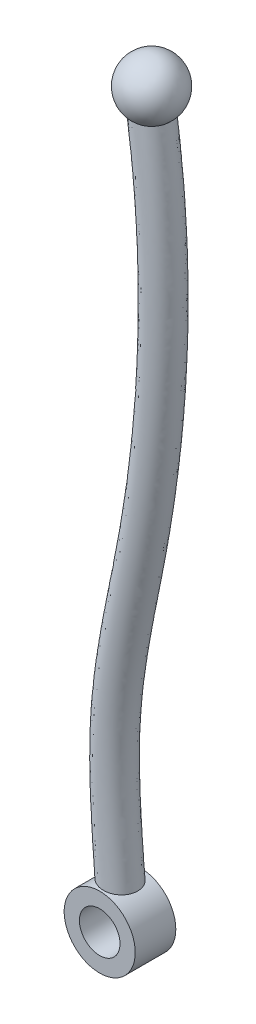
ISO-10303-21;
HEADER;
FILE_DESCRIPTION(('STEP AP214'),'2;1');
FILE_NAME('part.step','',(''),(''),'','','');
FILE_SCHEMA(('AUTOMOTIVE_DESIGN { 1 0 10303 214 1 1 1 1 }'));
ENDSEC;
DATA;
#1=APPLICATION_CONTEXT('core data for automotive mechanical design processes');
#2=APPLICATION_PROTOCOL_DEFINITION('international standard','automotive_design',2000,#1);
#3=PRODUCT_CONTEXT('',#1,'mechanical');
#4=PRODUCT('Part','Part','',(#3));
#5=PRODUCT_RELATED_PRODUCT_CATEGORY('part','',(#4));
#6=PRODUCT_DEFINITION_FORMATION('','',#4);
#7=PRODUCT_DEFINITION_CONTEXT('part definition',#1,'design');
#8=PRODUCT_DEFINITION('design','',#6,#7);
#9=PRODUCT_DEFINITION_SHAPE('','',#8);
#10=(LENGTH_UNIT() NAMED_UNIT(*) SI_UNIT(.MILLI.,.METRE.));
#11=(NAMED_UNIT(*) PLANE_ANGLE_UNIT() SI_UNIT($,.RADIAN.));
#12=(NAMED_UNIT(*) SI_UNIT($,.STERADIAN.) SOLID_ANGLE_UNIT());
#13=UNCERTAINTY_MEASURE_WITH_UNIT(LENGTH_MEASURE(1.E-05),#10,'distance_accuracy_value','');
#14=(GEOMETRIC_REPRESENTATION_CONTEXT(3) GLOBAL_UNCERTAINTY_ASSIGNED_CONTEXT((#13)) GLOBAL_UNIT_ASSIGNED_CONTEXT((#10,
#11,#12)) REPRESENTATION_CONTEXT('',''));
#15=CARTESIAN_POINT('',(0.,0.,0.));
#16=DIRECTION('',(0.,0.,1.));
#17=DIRECTION('',(1.,0.,0.));
#18=AXIS2_PLACEMENT_3D('',#15,#16,#17);
#19=CARTESIAN_POINT('',(0.,-7.,3.96039759223717));
#20=DIRECTION('',(0.,-1.,0.));
#21=DIRECTION('',(0.,0.,-1.));
#22=AXIS2_PLACEMENT_3D('',#19,#20,#21);
#23=PLANE('',#22);
#24=CARTESIAN_POINT('',(0.,-7.,4.));
#25=DIRECTION('',(0.,1.,0.));
#26=DIRECTION('',(0.,0.,1.));
#27=AXIS2_PLACEMENT_3D('',#24,#25,#26);
#28=CIRCLE('',#27,0.0396024077628267);
#29=CARTESIAN_POINT('',(0.,-7.,4.03960240776283));
#30=VERTEX_POINT('',#29);
#31=EDGE_CURVE('E66',#30,#30,#28,.T.);
#32=ORIENTED_EDGE('',*,*,#31,.T.);
#33=EDGE_LOOP('',(#32));
#34=FACE_BOUND('',#33,.T.);
#35=ADVANCED_FACE('F60',(#34),#23,.F.);
#36=CARTESIAN_POINT('',(0.,-7.03089007137969,4.));
#37=DIRECTION('',(0.,1.,0.));
#38=DIRECTION('',(0.,0.,1.));
#39=AXIS2_PLACEMENT_3D('',#36,#37,#38);
#40=PLANE('',#39);
#41=CARTESIAN_POINT('',(0.,-7.03089007137969,4.));
#42=DIRECTION('',(0.,1.,0.));
#43=DIRECTION('',(0.,0.,1.));
#44=AXIS2_PLACEMENT_3D('',#41,#42,#43);
#45=CIRCLE('',#44,0.0396024077628267);
#46=CARTESIAN_POINT('',(0.,-7.03089007137969,4.03960240776283));
#47=VERTEX_POINT('',#46);
#48=EDGE_CURVE('E12',#47,#47,#45,.T.);
#49=ORIENTED_EDGE('',*,*,#48,.F.);
#50=EDGE_LOOP('',(#49));
#51=FACE_BOUND('',#50,.T.);
#52=ADVANCED_FACE('F75',(#51),#40,.F.);
#53=CARTESIAN_POINT('',(0.,-7.,4.));
#54=DIRECTION('',(0.,1.,0.));
#55=DIRECTION('',(0.,0.,1.));
#56=AXIS2_PLACEMENT_3D('',#53,#54,#55);
#57=CYLINDRICAL_SURFACE('',#56,0.0396024077628267);
#58=ORIENTED_EDGE('',*,*,#31,.F.);
#59=EDGE_LOOP('',(#58));
#60=FACE_BOUND('',#59,.T.);
#61=ORIENTED_EDGE('',*,*,#48,.T.);
#62=EDGE_LOOP('',(#61));
#63=FACE_BOUND('',#62,.T.);
#64=ADVANCED_FACE('F73',(#60,#63),#57,.T.);
#65=CLOSED_SHELL('',(#35,#52,#64));
#66=MANIFOLD_SOLID_BREP('B2',#65);
#67=CARTESIAN_POINT('',(0.,0.,8.));
#68=DIRECTION('',(0.,0.,-1.));
#69=DIRECTION('',(-1.,0.,0.));
#70=AXIS2_PLACEMENT_3D('',#67,#68,#69);
#71=CYLINDRICAL_SURFACE('',#70,7.);
#72=CARTESIAN_POINT('',(0.,0.,0.));
#73=DIRECTION('',(0.,0.,1.));
#74=DIRECTION('',(1.,0.,0.));
#75=AXIS2_PLACEMENT_3D('',#72,#73,#74);
#76=CIRCLE('',#75,7.);
#77=CARTESIAN_POINT('',(7.,0.,0.));
#78=VERTEX_POINT('',#77);
#79=EDGE_CURVE('E146',#78,#78,#76,.T.);
#80=ORIENTED_EDGE('',*,*,#79,.T.);
#81=EDGE_LOOP('',(#80));
#82=FACE_BOUND('',#81,.T.);
#83=CARTESIAN_POINT('',(0.,0.,8.));
#84=DIRECTION('',(0.,0.,1.));
#85=DIRECTION('',(1.,0.,0.));
#86=AXIS2_PLACEMENT_3D('',#83,#84,#85);
#87=CIRCLE('',#86,7.);
#88=CARTESIAN_POINT('',(7.,0.,8.));
#89=VERTEX_POINT('',#88);
#90=EDGE_CURVE('E135',#89,#89,#87,.T.);
#91=ORIENTED_EDGE('',*,*,#90,.F.);
#92=EDGE_LOOP('',(#91));
#93=FACE_BOUND('',#92,.T.);
#94=CARTESIAN_POINT('',(2.42365806243927E-09,7.,7.5));
#95=CARTESIAN_POINT('',(0.0422400356138431,7.00000076805746,7.50000073274698));
#96=CARTESIAN_POINT('',(0.0844796114102227,6.9996176935888,7.49922288932425));
#97=CARTESIAN_POINT('',(0.16868741892609,6.99809306650622,7.49612927228377));
#98=CARTESIAN_POINT('',(0.210655985432426,6.99695513154904,7.49382083404208));
#99=CARTESIAN_POINT('',(0.294323815693168,6.99393459760473,7.4876945756797));
#100=CARTESIAN_POINT('',(0.336023511149844,6.99205433473992,7.48388149073423));
#101=CARTESIAN_POINT('',(0.419155721375281,6.98756312538778,7.47476917137856));
#102=CARTESIAN_POINT('',(0.460588547421802,6.98495330180796,7.46947222084216));
#103=CARTESIAN_POINT('',(0.54318327893848,6.97901612384671,7.45740978161843));
#104=CARTESIAN_POINT('',(0.584345213643453,6.97568884824667,7.45064445416889));
#105=CARTESIAN_POINT('',(0.666408373617677,6.96832834444628,7.43565524670615));
#106=CARTESIAN_POINT('',(0.707309068106672,6.96429398061942,7.42742902011428));
#107=CARTESIAN_POINT('',(0.788851812160291,6.95553010718593,7.40952236378143));
#108=CARTESIAN_POINT('',(0.829492642778194,6.95079845000549,7.39983743933177));
#109=CARTESIAN_POINT('',(0.910517436434897,6.94065089772847,7.37901231997466));
#110=CARTESIAN_POINT('',(0.950899335048052,6.93523193208417,7.36786558633951));
#111=CARTESIAN_POINT('',(0.991029119954068,6.92949213713946,7.35602293267703));
#112=B_SPLINE_CURVE_WITH_KNOTS('',3,(#94,#95,#96,#97,#98,#99,#100,#101,#102,#103,#104,#105,#106,
#107,#108,#109,#110,#111),.UNSPECIFIED.,.F.,.F.,(4,2,2,2,2,2,2,2,4),(0.,0.126710488419665,
0.252818064152274,0.378531900178072,0.504053298430019,0.629560920543931,0.755271994166555,
0.881378662671853,1.00806998450979),.UNSPECIFIED.);
#113=CARTESIAN_POINT('',(0.,7.,7.5));
#114=VERTEX_POINT('',#113);
#115=CARTESIAN_POINT('',(0.991029122350048,6.92949213713776,7.35602293197301));
#116=VERTEX_POINT('',#115);
#117=EDGE_CURVE('E58',#114,#116,#112,.T.);
#118=ORIENTED_EDGE('',*,*,#117,.F.);
#119=DIRECTION('',(0.,0.,-1.));
#120=VECTOR('',#119,1.);
#121=CARTESIAN_POINT('',(0.,7.,8.));
#122=LINE('',#121,#120);
#123=CARTESIAN_POINT('',(0.,7.,0.500000000000001));
#124=VERTEX_POINT('',#123);
#125=EDGE_CURVE('E109',#114,#124,#122,.T.);
#126=ORIENTED_EDGE('',*,*,#125,.T.);
#127=CARTESIAN_POINT('',(0.99102911996432,6.92949213747896,0.643977067322961));
#128=CARTESIAN_POINT('',(0.950899335035006,6.93523193220807,0.632134413655968));
#129=CARTESIAN_POINT('',(0.910517436414653,6.94065089776374,0.620987680019741));
#130=CARTESIAN_POINT('',(0.829492642755576,6.95079844997574,0.600162560662808));
#131=CARTESIAN_POINT('',(0.788851812142409,6.95553010717923,0.590477636214458));
#132=CARTESIAN_POINT('',(0.707309068095003,6.96429398062927,0.572570979883343));
#133=CARTESIAN_POINT('',(0.6664083736075,6.96832834444972,0.5643447532919));
#134=CARTESIAN_POINT('',(0.584345213637771,6.97568884824466,0.549355545830163));
#135=CARTESIAN_POINT('',(0.543183278935804,6.97901612384566,0.54259021838118));
#136=CARTESIAN_POINT('',(0.460588547423475,6.98495330180909,0.530527779158093));
#137=CARTESIAN_POINT('',(0.41915572137829,6.98756312539012,0.52523082862183));
#138=CARTESIAN_POINT('',(0.336023511156024,6.99205433473708,0.516118509266392));
#139=CARTESIAN_POINT('',(0.294323815701186,6.99393459759551,0.512305424321015));
#140=CARTESIAN_POINT('',(0.210655985444895,6.99695513155755,0.506179165958709));
#141=CARTESIAN_POINT('',(0.168687418941174,6.99809306653893,0.503870727716985));
#142=CARTESIAN_POINT('',(0.0844796114269324,6.99961769355535,0.50077711067617));
#143=CARTESIAN_POINT('',(0.042240035629553,7.00000076793306,0.499999267253231));
#144=CARTESIAN_POINT('',(2.43718194990733E-09,6.99999999965321,0.500000000000002));
#145=B_SPLINE_CURVE_WITH_KNOTS('',3,(#127,#128,#129,#130,#131,#132,#133,#134,#135,#136,#137,
#138,#139,#140,#141,#142,#143,#144),.UNSPECIFIED.,.F.,.F.,(4,2,2,2,2,2,2,2,4),(0.,
0.126691321825357,0.252797990324944,0.378509063940461,0.504016686045815,0.629538084293607,
0.755251920313766,0.881359496039202,1.0080699844594),.UNSPECIFIED.);
#146=CARTESIAN_POINT('',(0.99102911996432,6.92949213747896,0.643977067322961));
#147=VERTEX_POINT('',#146);
#148=EDGE_CURVE('E124',#147,#124,#145,.T.);
#149=ORIENTED_EDGE('',*,*,#148,.F.);
#150=DIRECTION('',(0.,0.,-1.));
#151=VECTOR('',#150,1.);
#152=CARTESIAN_POINT('',(0.991029122350048,6.92949213713776,8.));
#153=LINE('',#152,#151);
#154=EDGE_CURVE('E119',#147,#116,#153,.F.);
#155=ORIENTED_EDGE('',*,*,#154,.T.);
#156=EDGE_LOOP('',(#118,#126,#149,#155));
#157=FACE_BOUND('',#156,.T.);
#158=ADVANCED_FACE('F100',(#82,#93,#157),#71,.T.);
#159=CARTESIAN_POINT('',(0.,0.,8.));
#160=DIRECTION('',(0.,0.,1.));
#161=DIRECTION('',(1.,0.,0.));
#162=AXIS2_PLACEMENT_3D('',#159,#160,#161);
#163=PLANE('',#162);
#164=CARTESIAN_POINT('',(0.,0.,8.));
#165=DIRECTION('',(0.,0.,1.));
#166=DIRECTION('',(1.,0.,0.));
#167=AXIS2_PLACEMENT_3D('',#164,#165,#166);
#168=CIRCLE('',#167,4.);
#169=CARTESIAN_POINT('',(4.,0.,8.));
#170=VERTEX_POINT('',#169);
#171=EDGE_CURVE('E138',#170,#170,#168,.T.);
#172=ORIENTED_EDGE('',*,*,#171,.F.);
#173=EDGE_LOOP('',(#172));
#174=FACE_BOUND('',#173,.T.);
#175=ORIENTED_EDGE('',*,*,#90,.T.);
#176=EDGE_LOOP('',(#175));
#177=FACE_BOUND('',#176,.T.);
#178=ADVANCED_FACE('F182',(#174,#177),#163,.T.);
#179=CARTESIAN_POINT('',(0.,0.,0.));
#180=DIRECTION('',(0.,0.,1.));
#181=DIRECTION('',(1.,0.,0.));
#182=AXIS2_PLACEMENT_3D('',#179,#180,#181);
#183=PLANE('',#182);
#184=CARTESIAN_POINT('',(0.,0.,0.));
#185=DIRECTION('',(0.,0.,1.));
#186=DIRECTION('',(1.,0.,0.));
#187=AXIS2_PLACEMENT_3D('',#184,#185,#186);
#188=CIRCLE('',#187,4.);
#189=CARTESIAN_POINT('',(4.,0.,0.));
#190=VERTEX_POINT('',#189);
#191=EDGE_CURVE('E141',#190,#190,#188,.F.);
#192=ORIENTED_EDGE('',*,*,#191,.F.);
#193=EDGE_LOOP('',(#192));
#194=FACE_BOUND('',#193,.T.);
#195=ORIENTED_EDGE('',*,*,#79,.F.);
#196=EDGE_LOOP('',(#195));
#197=FACE_BOUND('',#196,.T.);
#198=ADVANCED_FACE('F180',(#194,#197),#183,.F.);
#199=CARTESIAN_POINT('',(0.,0.,-0.000999999999999265));
#200=DIRECTION('',(0.,0.,1.));
#201=DIRECTION('',(1.,0.,0.));
#202=AXIS2_PLACEMENT_3D('',#199,#200,#201);
#203=CYLINDRICAL_SURFACE('',#202,4.);
#204=ORIENTED_EDGE('',*,*,#171,.T.);
#205=EDGE_LOOP('',(#204));
#206=FACE_BOUND('',#205,.T.);
#207=ORIENTED_EDGE('',*,*,#191,.T.);
#208=EDGE_LOOP('',(#207));
#209=FACE_BOUND('',#208,.T.);
#210=ADVANCED_FACE('F177',(#206,#209),#203,.F.);
#211=CARTESIAN_POINT('',(0.,7.,0.500000000000002));
#212=DIRECTION('',(-0.0709667240242291,-0.997478683522244,0.));
#213=DIRECTION('',(0.997478683522244,-0.0709667240242291,0.));
#214=AXIS2_PLACEMENT_3D('',#211,#212,#213);
#215=PLANE('',#214);
#216=ORIENTED_EDGE('',*,*,#125,.F.);
#217=CARTESIAN_POINT('',(0.,7.,4.));
#218=DIRECTION('',(-0.0709667240242293,-0.997478683522244,0.));
#219=DIRECTION('',(0.997478683522244,-0.0709667240242293,0.));
#220=AXIS2_PLACEMENT_3D('',#217,#218,#219);
#221=CIRCLE('',#220,3.5);
#222=EDGE_CURVE('E132',#114,#124,#221,.T.);
#223=ORIENTED_EDGE('',*,*,#222,.T.);
#224=EDGE_LOOP('',(#216,#223));
#225=FACE_BOUND('',#224,.T.);
#226=ADVANCED_FACE('F137',(#225),#215,.T.);
#227=ORIENTED_EDGE('',*,*,#154,.F.);
#228=EDGE_CURVE('E134',#147,#116,#221,.T.);
#229=ORIENTED_EDGE('',*,*,#228,.T.);
#230=EDGE_LOOP('',(#227,#229));
#231=FACE_BOUND('',#230,.T.);
#232=ADVANCED_FACE('F163',(#231),#215,.T.);
#233=CARTESIAN_POINT('',(6.224984939727,141.094605048668,7.5));
#234=CARTESIAN_POINT('',(8.09432476081943,128.630208187559,7.5));
#235=CARTESIAN_POINT('',(9.44096568560838,103.771910499148,7.5));
#236=CARTESIAN_POINT('',(6.66384074897124,78.6200375004063,7.5));
#237=CARTESIAN_POINT('',(2.5469197670364,56.4457829138081,7.5));
#238=CARTESIAN_POINT('',(0.0620829769121219,46.1202623797454,7.5));
#239=CARTESIAN_POINT('',(-1.50982652551515,26.4687052489353,7.5));
#240=CARTESIAN_POINT('',(-0.739284176276744,16.4784859307159,7.5));
#241=CARTESIAN_POINT('',(0.,7.,7.5));
#242=CARTESIAN_POINT('',(13.224984939727,141.094605048668,7.5));
#243=CARTESIAN_POINT('',(15.0866477033076,128.247737728982,7.5));
#244=CARTESIAN_POINT('',(16.41814416546,102.634943990425,7.5));
#245=CARTESIAN_POINT('',(13.2800004350651,76.3541547611059,7.5));
#246=CARTESIAN_POINT('',(9.15682447452879,54.1266065140505,7.5));
#247=CARTESIAN_POINT('',(6.79492610185322,44.1529221818994,7.5));
#248=CARTESIAN_POINT('',(5.38186652066269,25.2166333266626,7.5));
#249=CARTESIAN_POINT('',(6.19851362427875,15.6105306361393,7.5));
#250=CARTESIAN_POINT('',(6.98235078465571,6.5032329318304,7.5));
#251=CARTESIAN_POINT('',(13.224984939727,141.094605048668,0.500000000000001));
#252=CARTESIAN_POINT('',(15.0866477033076,128.247737728982,0.500000000000001));
#253=CARTESIAN_POINT('',(16.41814416546,102.634943990425,0.499999999999999));
#254=CARTESIAN_POINT('',(13.2800004350651,76.3541547611059,0.500000000000001));
#255=CARTESIAN_POINT('',(9.15682447452879,54.1266065140505,0.500000000000003));
#256=CARTESIAN_POINT('',(6.79492610185322,44.1529221818994,0.500000000000004));
#257=CARTESIAN_POINT('',(5.38186652066269,25.2166333266626,0.500000000000004));
#258=CARTESIAN_POINT('',(6.19851362427875,15.6105306361393,0.500000000000004));
#259=CARTESIAN_POINT('',(6.98235078465571,6.5032329318304,0.500000000000003));
#260=CARTESIAN_POINT('',(6.224984939727,141.094605048668,0.5));
#261=CARTESIAN_POINT('',(8.09432476081943,128.630208187559,0.5));
#262=CARTESIAN_POINT('',(9.44096568560838,103.771910499148,0.499999999999998));
#263=CARTESIAN_POINT('',(6.66384074897124,78.6200375004063,0.5));
#264=CARTESIAN_POINT('',(2.5469197670364,56.4457829138081,0.500000000000002));
#265=CARTESIAN_POINT('',(0.0620829769121219,46.1202623797454,0.500000000000003));
#266=CARTESIAN_POINT('',(-1.50982652551515,26.4687052489353,0.500000000000003));
#267=CARTESIAN_POINT('',(-0.739284176276744,16.4784859307159,0.500000000000003));
#268=CARTESIAN_POINT('',(0.,7.,0.500000000000002));
#269=CARTESIAN_POINT('',(-0.775015060272995,141.094605048668,0.499999999999999));
#270=CARTESIAN_POINT('',(1.10200181833132,129.012678646135,0.499999999999999));
#271=CARTESIAN_POINT('',(2.46378720575675,104.908877007871,0.499999999999997));
#272=CARTESIAN_POINT('',(0.0476810628774123,80.8859202397068,0.499999999999999));
#273=CARTESIAN_POINT('',(-4.062984940456,58.7649593135658,0.500000000000001));
#274=CARTESIAN_POINT('',(-6.67076014802897,48.0876025775913,0.500000000000003));
#275=CARTESIAN_POINT('',(-8.40151957169297,27.7207771712078,0.500000000000003));
#276=CARTESIAN_POINT('',(-7.67708197683223,17.3464412252924,0.500000000000003));
#277=CARTESIAN_POINT('',(-6.98235078465571,7.49676706816957,0.500000000000001));
#278=CARTESIAN_POINT('',(-0.775015060272995,141.094605048668,7.5));
#279=CARTESIAN_POINT('',(1.10200181833132,129.012678646135,7.5));
#280=CARTESIAN_POINT('',(2.46378720575675,104.908877007871,7.5));
#281=CARTESIAN_POINT('',(0.0476810628774123,80.8859202397068,7.5));
#282=CARTESIAN_POINT('',(-4.062984940456,58.7649593135658,7.5));
#283=CARTESIAN_POINT('',(-6.67076014802897,48.0876025775913,7.5));
#284=CARTESIAN_POINT('',(-8.40151957169297,27.7207771712078,7.5));
#285=CARTESIAN_POINT('',(-7.67708197683223,17.3464412252924,7.5));
#286=CARTESIAN_POINT('',(-6.98235078465571,7.49676706816957,7.5));
#287=CARTESIAN_POINT('',(6.224984939727,141.094605048668,7.5));
#288=CARTESIAN_POINT('',(8.09432476081943,128.630208187559,7.5));
#289=CARTESIAN_POINT('',(9.44096568560838,103.771910499148,7.5));
#290=CARTESIAN_POINT('',(6.66384074897124,78.6200375004063,7.5));
#291=CARTESIAN_POINT('',(2.5469197670364,56.4457829138081,7.5));
#292=CARTESIAN_POINT('',(0.0620829769121219,46.1202623797454,7.5));
#293=CARTESIAN_POINT('',(-1.50982652551515,26.4687052489353,7.5));
#294=CARTESIAN_POINT('',(-0.739284176276744,16.4784859307159,7.5));
#295=CARTESIAN_POINT('',(0.,7.,7.5));
#296=(BOUNDED_SURFACE() B_SPLINE_SURFACE(3,3,((#233,#234,#235,#236,#237,#238,#239,#240,#241),
(#242,#243,#244,#245,#246,#247,#248,#249,#250),(#251,#252,#253,#254,#255,#256,#257,#258,#259),
(#260,#261,#262,#263,#264,#265,#266,#267,#268),(#269,#270,#271,#272,#273,#274,#275,#276,#277),
(#278,#279,#280,#281,#282,#283,#284,#285,#286),(#287,#288,#289,#290,#291,#292,#293,#294,#295)),
.UNSPECIFIED.,.T.,.F.,.F.) B_SPLINE_SURFACE_WITH_KNOTS((4,3,4),(4,1,1,1,1,1,4),(0.,0.5,1.),(0.,
0.28,0.552353493724002,0.56,0.78,0.787404647647404,1.),
.UNSPECIFIED.) GEOMETRIC_REPRESENTATION_ITEM() RATIONAL_B_SPLINE_SURFACE(((1.,1.,1.,1.,1.,1.,1.,
1.,1.),(0.333333333333333,0.333333333333333,0.333333333333333,0.333333333333333,
0.333333333333333,0.333333333333333,0.333333333333333,0.333333333333333,0.333333333333333),
(0.333333333333333,0.333333333333333,0.333333333333333,0.333333333333333,0.333333333333333,
0.333333333333333,0.333333333333333,0.333333333333333,0.333333333333333),(1.,1.,1.,1.,1.,1.,1.,
1.,1.),(0.333333333333333,0.333333333333333,0.333333333333333,0.333333333333333,
0.333333333333333,0.333333333333333,0.333333333333333,0.333333333333333,0.333333333333333),
(0.333333333333333,0.333333333333333,0.333333333333333,0.333333333333333,0.333333333333333,
0.333333333333333,0.333333333333333,0.333333333333333,0.333333333333333),(1.,1.,1.,1.,1.,1.,1.,
1.,1.))) REPRESENTATION_ITEM('') SURFACE());
#297=CARTESIAN_POINT('',(6.224984939727,141.094605048668,4.));
#298=DIRECTION('',(0.,1.,0.));
#299=DIRECTION('',(0.,0.,1.));
#300=AXIS2_PLACEMENT_3D('',#297,#298,#299);
#301=CIRCLE('',#300,3.5);
#302=CARTESIAN_POINT('',(6.224984939727,141.094605048668,7.5));
#303=VERTEX_POINT('',#302);
#304=EDGE_CURVE('E104',#303,#303,#301,.T.);
#305=ORIENTED_EDGE('',*,*,#304,.F.);
#306=EDGE_LOOP('',(#305));
#307=FACE_BOUND('',#306,.T.);
#308=ORIENTED_EDGE('',*,*,#222,.F.);
#309=ORIENTED_EDGE('',*,*,#117,.T.);
#310=ORIENTED_EDGE('',*,*,#228,.F.);
#311=ORIENTED_EDGE('',*,*,#148,.T.);
#312=EDGE_LOOP('',(#308,#309,#310,#311));
#313=FACE_BOUND('',#312,.T.);
#314=ADVANCED_FACE('F131',(#307,#313),#296,.F.);
#315=CARTESIAN_POINT('',(6.224984939727,145.482105048668,4.));
#316=DIRECTION('',(0.,0.,1.));
#317=DIRECTION('',(1.,0.,0.));
#318=AXIS2_PLACEMENT_3D('',#315,#316,#317);
#319=SPHERICAL_SURFACE('',#318,5.6125);
#320=CARTESIAN_POINT('',(6.224984939727,145.482105048668,4.));
#321=DIRECTION('',(0.,1.,0.));
#322=DIRECTION('',(0.,0.,1.));
#323=AXIS2_PLACEMENT_3D('',#320,#321,#322);
#324=SPHERICAL_SURFACE('',#323,5.6125);
#325=ORIENTED_EDGE('',*,*,#304,.T.);
#326=EDGE_LOOP('',(#325));
#327=FACE_BOUND('',#326,.T.);
#328=ADVANCED_FACE('F102',(#327),#324,.T.);
#329=CLOSED_SHELL('',(#158,#178,#198,#210,#226,#232,#314,#328));
#330=MANIFOLD_SOLID_BREP('B7',#329);
#331=ADVANCED_BREP_SHAPE_REPRESENTATION('',(#18,#66,#330),#14);
#332=SHAPE_DEFINITION_REPRESENTATION(#9,#331);
ENDSEC;
END-ISO-10303-21;
